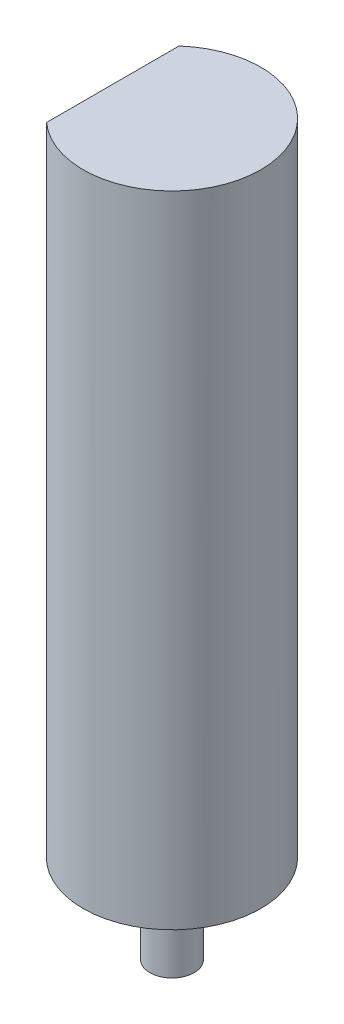
ISO-10303-21;
HEADER;
FILE_DESCRIPTION(('STEP AP214'),'2;1');
FILE_NAME('part.step','',(''),(''),'','','');
FILE_SCHEMA(('AUTOMOTIVE_DESIGN { 1 0 10303 214 1 1 1 1 }'));
ENDSEC;
DATA;
#1=APPLICATION_CONTEXT('core data for automotive mechanical design processes');
#2=APPLICATION_PROTOCOL_DEFINITION('international standard','automotive_design',2000,#1);
#3=PRODUCT_CONTEXT('',#1,'mechanical');
#4=PRODUCT('Part','Part','',(#3));
#5=PRODUCT_RELATED_PRODUCT_CATEGORY('part','',(#4));
#6=PRODUCT_DEFINITION_FORMATION('','',#4);
#7=PRODUCT_DEFINITION_CONTEXT('part definition',#1,'design');
#8=PRODUCT_DEFINITION('design','',#6,#7);
#9=PRODUCT_DEFINITION_SHAPE('','',#8);
#10=(LENGTH_UNIT() NAMED_UNIT(*) SI_UNIT(.MILLI.,.METRE.));
#11=(NAMED_UNIT(*) PLANE_ANGLE_UNIT() SI_UNIT($,.RADIAN.));
#12=(NAMED_UNIT(*) SI_UNIT($,.STERADIAN.) SOLID_ANGLE_UNIT());
#13=UNCERTAINTY_MEASURE_WITH_UNIT(LENGTH_MEASURE(1.E-05),#10,'distance_accuracy_value','');
#14=(GEOMETRIC_REPRESENTATION_CONTEXT(3) GLOBAL_UNCERTAINTY_ASSIGNED_CONTEXT((#13)) GLOBAL_UNIT_ASSIGNED_CONTEXT((#10,
#11,#12)) REPRESENTATION_CONTEXT('',''));
#15=CARTESIAN_POINT('',(0.,0.,0.));
#16=DIRECTION('',(0.,0.,1.));
#17=DIRECTION('',(1.,0.,0.));
#18=AXIS2_PLACEMENT_3D('',#15,#16,#17);
#19=CARTESIAN_POINT('',(0.,10.8,0.));
#20=DIRECTION('',(0.,-1.,0.));
#21=DIRECTION('',(0.,0.,-1.));
#22=AXIS2_PLACEMENT_3D('',#19,#20,#21);
#23=CYLINDRICAL_SURFACE('',#22,1.5);
#24=CARTESIAN_POINT('',(0.,10.8,0.));
#25=DIRECTION('',(0.,1.,0.));
#26=DIRECTION('',(0.,0.,1.));
#27=AXIS2_PLACEMENT_3D('',#24,#25,#26);
#28=CIRCLE('',#27,1.5);
#29=CARTESIAN_POINT('',(-1.,10.8,1.11803398874989));
#30=VERTEX_POINT('',#29);
#31=CARTESIAN_POINT('',(-1.,10.8,-1.11803398874989));
#32=VERTEX_POINT('',#31);
#33=EDGE_CURVE('E43',#30,#32,#28,.T.);
#34=ORIENTED_EDGE('',*,*,#33,.F.);
#35=DIRECTION('',(0.,1.,0.));
#36=VECTOR('',#35,1.);
#37=CARTESIAN_POINT('',(-1.,4.8,1.11803398874989));
#38=LINE('',#37,#36);
#39=CARTESIAN_POINT('',(-1.,4.8,1.11803398874989));
#40=VERTEX_POINT('',#39);
#41=EDGE_CURVE('E50',#40,#30,#38,.T.);
#42=ORIENTED_EDGE('',*,*,#41,.F.);
#43=CARTESIAN_POINT('',(0.,4.8,0.));
#44=DIRECTION('',(0.,1.,0.));
#45=DIRECTION('',(0.,0.,1.));
#46=AXIS2_PLACEMENT_3D('',#43,#44,#45);
#47=CIRCLE('',#46,1.5);
#48=CARTESIAN_POINT('',(-1.,4.8,-1.11803398874989));
#49=VERTEX_POINT('',#48);
#50=EDGE_CURVE('E66',#49,#40,#47,.T.);
#51=ORIENTED_EDGE('',*,*,#50,.F.);
#52=DIRECTION('',(0.,1.,0.));
#53=VECTOR('',#52,1.);
#54=CARTESIAN_POINT('',(-1.,4.8,-1.11803398874989));
#55=LINE('',#54,#53);
#56=EDGE_CURVE('E56',#49,#32,#55,.T.);
#57=ORIENTED_EDGE('',*,*,#56,.T.);
#58=EDGE_LOOP('',(#34,#42,#51,#57));
#59=FACE_BOUND('',#58,.T.);
#60=CARTESIAN_POINT('',(0.,0.,0.));
#61=DIRECTION('',(0.,1.,0.));
#62=DIRECTION('',(0.,0.,1.));
#63=AXIS2_PLACEMENT_3D('',#60,#61,#62);
#64=CIRCLE('',#63,1.5);
#65=CARTESIAN_POINT('',(0.,0.,1.5));
#66=VERTEX_POINT('',#65);
#67=EDGE_CURVE('E72',#66,#66,#64,.T.);
#68=ORIENTED_EDGE('',*,*,#67,.T.);
#69=EDGE_LOOP('',(#68));
#70=FACE_BOUND('',#69,.T.);
#71=ADVANCED_FACE('F36',(#59,#70),#23,.T.);
#72=CARTESIAN_POINT('',(0.,10.8,0.));
#73=DIRECTION('',(0.,1.,0.));
#74=DIRECTION('',(0.,0.,1.));
#75=AXIS2_PLACEMENT_3D('',#72,#73,#74);
#76=PLANE('',#75);
#77=DIRECTION('',(0.,0.,-1.));
#78=VECTOR('',#77,1.);
#79=CARTESIAN_POINT('',(-1.,10.8,1.11803398874989));
#80=LINE('',#79,#78);
#81=EDGE_CURVE('E61',#30,#32,#80,.T.);
#82=ORIENTED_EDGE('',*,*,#81,.F.);
#83=ORIENTED_EDGE('',*,*,#33,.T.);
#84=EDGE_LOOP('',(#82,#83));
#85=FACE_BOUND('',#84,.T.);
#86=ADVANCED_FACE('F74',(#85),#76,.T.);
#87=CARTESIAN_POINT('',(0.,0.,0.));
#88=DIRECTION('',(0.,1.,0.));
#89=DIRECTION('',(0.,0.,1.));
#90=AXIS2_PLACEMENT_3D('',#87,#88,#89);
#91=PLANE('',#90);
#92=CARTESIAN_POINT('',(0.,0.,0.));
#93=DIRECTION('',(0.,1.,0.));
#94=DIRECTION('',(0.,0.,1.));
#95=AXIS2_PLACEMENT_3D('',#92,#93,#94);
#96=CIRCLE('',#95,0.375);
#97=CARTESIAN_POINT('',(0.,0.,0.375));
#98=VERTEX_POINT('',#97);
#99=EDGE_CURVE('E11',#98,#98,#96,.F.);
#100=ORIENTED_EDGE('',*,*,#99,.F.);
#101=EDGE_LOOP('',(#100));
#102=FACE_BOUND('',#101,.T.);
#103=ORIENTED_EDGE('',*,*,#67,.F.);
#104=EDGE_LOOP('',(#103));
#105=FACE_BOUND('',#104,.T.);
#106=ADVANCED_FACE('F94',(#102,#105),#91,.F.);
#107=CARTESIAN_POINT('',(-1.,4.8,1.11803398874989));
#108=DIRECTION('',(1.,0.,0.));
#109=DIRECTION('',(0.,0.,-1.));
#110=AXIS2_PLACEMENT_3D('',#107,#108,#109);
#111=PLANE('',#110);
#112=ORIENTED_EDGE('',*,*,#81,.T.);
#113=ORIENTED_EDGE('',*,*,#56,.F.);
#114=DIRECTION('',(0.,0.,-1.));
#115=VECTOR('',#114,1.);
#116=CARTESIAN_POINT('',(-1.,4.8,1.11803398874989));
#117=LINE('',#116,#115);
#118=EDGE_CURVE('E78',#40,#49,#117,.T.);
#119=ORIENTED_EDGE('',*,*,#118,.F.);
#120=ORIENTED_EDGE('',*,*,#41,.T.);
#121=EDGE_LOOP('',(#112,#113,#119,#120));
#122=FACE_BOUND('',#121,.T.);
#123=ADVANCED_FACE('F62',(#122),#111,.F.);
#124=CARTESIAN_POINT('',(0.,4.8,0.));
#125=DIRECTION('',(0.,1.,0.));
#126=DIRECTION('',(0.,0.,1.));
#127=AXIS2_PLACEMENT_3D('',#124,#125,#126);
#128=PLANE('',#127);
#129=ORIENTED_EDGE('',*,*,#50,.T.);
#130=ORIENTED_EDGE('',*,*,#118,.T.);
#131=EDGE_LOOP('',(#129,#130));
#132=FACE_BOUND('',#131,.T.);
#133=ADVANCED_FACE('F90',(#132),#128,.T.);
#134=CARTESIAN_POINT('',(0.,-1.5,0.));
#135=DIRECTION('',(0.,1.,0.));
#136=DIRECTION('',(0.,0.,1.));
#137=AXIS2_PLACEMENT_3D('',#134,#135,#136);
#138=CYLINDRICAL_SURFACE('',#137,0.375);
#139=CARTESIAN_POINT('',(0.,-1.5,0.));
#140=DIRECTION('',(0.,-1.,0.));
#141=DIRECTION('',(0.,0.,-1.));
#142=AXIS2_PLACEMENT_3D('',#139,#140,#141);
#143=CIRCLE('',#142,0.375);
#144=CARTESIAN_POINT('',(0.,-1.5,-0.375));
#145=VERTEX_POINT('',#144);
#146=EDGE_CURVE('E67',#145,#145,#143,.T.);
#147=ORIENTED_EDGE('',*,*,#146,.F.);
#148=EDGE_LOOP('',(#147));
#149=FACE_BOUND('',#148,.T.);
#150=ORIENTED_EDGE('',*,*,#99,.T.);
#151=EDGE_LOOP('',(#150));
#152=FACE_BOUND('',#151,.T.);
#153=ADVANCED_FACE('F87',(#149,#152),#138,.T.);
#154=CARTESIAN_POINT('',(0.,-1.5,0.));
#155=DIRECTION('',(0.,-1.,0.));
#156=DIRECTION('',(0.,0.,-1.));
#157=AXIS2_PLACEMENT_3D('',#154,#155,#156);
#158=PLANE('',#157);
#159=ORIENTED_EDGE('',*,*,#146,.T.);
#160=EDGE_LOOP('',(#159));
#161=FACE_BOUND('',#160,.T.);
#162=ADVANCED_FACE('F85',(#161),#158,.T.);
#163=CLOSED_SHELL('',(#71,#86,#106,#123,#133,#153,#162));
#164=MANIFOLD_SOLID_BREP('B2',#163);
#165=ADVANCED_BREP_SHAPE_REPRESENTATION('',(#18,#164),#14);
#166=SHAPE_DEFINITION_REPRESENTATION(#9,#165);
ENDSEC;
END-ISO-10303-21;
